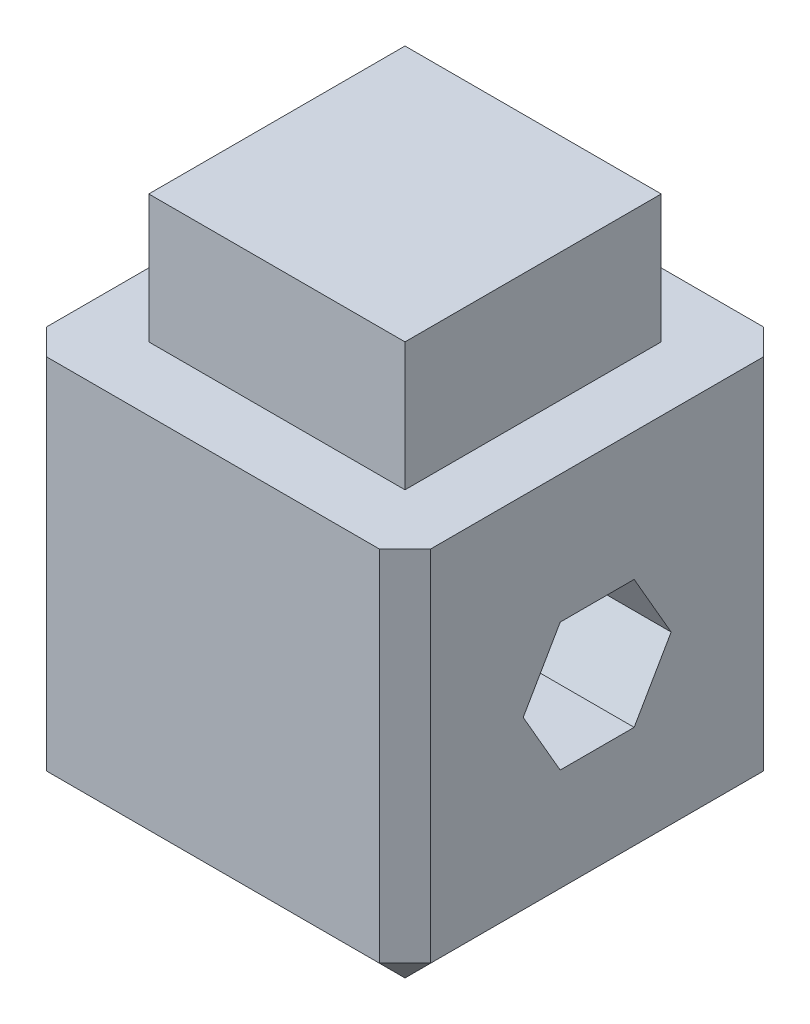
ISO-10303-21;
HEADER;
FILE_DESCRIPTION(('STEP AP214'),'2;1');
FILE_NAME('part.step','',(''),(''),'','','');
FILE_SCHEMA(('AUTOMOTIVE_DESIGN { 1 0 10303 214 1 1 1 1 }'));
ENDSEC;
DATA;
#1=APPLICATION_CONTEXT('core data for automotive mechanical design processes');
#2=APPLICATION_PROTOCOL_DEFINITION('international standard','automotive_design',2000,#1);
#3=PRODUCT_CONTEXT('',#1,'mechanical');
#4=PRODUCT('Part','Part','',(#3));
#5=PRODUCT_RELATED_PRODUCT_CATEGORY('part','',(#4));
#6=PRODUCT_DEFINITION_FORMATION('','',#4);
#7=PRODUCT_DEFINITION_CONTEXT('part definition',#1,'design');
#8=PRODUCT_DEFINITION('design','',#6,#7);
#9=PRODUCT_DEFINITION_SHAPE('','',#8);
#10=(LENGTH_UNIT() NAMED_UNIT(*) SI_UNIT(.MILLI.,.METRE.));
#11=(NAMED_UNIT(*) PLANE_ANGLE_UNIT() SI_UNIT($,.RADIAN.));
#12=(NAMED_UNIT(*) SI_UNIT($,.STERADIAN.) SOLID_ANGLE_UNIT());
#13=UNCERTAINTY_MEASURE_WITH_UNIT(LENGTH_MEASURE(1.E-05),#10,'distance_accuracy_value','');
#14=(GEOMETRIC_REPRESENTATION_CONTEXT(3) GLOBAL_UNCERTAINTY_ASSIGNED_CONTEXT((#13)) GLOBAL_UNIT_ASSIGNED_CONTEXT((#10,
#11,#12)) REPRESENTATION_CONTEXT('',''));
#15=CARTESIAN_POINT('',(0.,0.,0.));
#16=DIRECTION('',(0.,0.,1.));
#17=DIRECTION('',(1.,0.,0.));
#18=AXIS2_PLACEMENT_3D('',#15,#16,#17);
#19=CARTESIAN_POINT('',(19.05,50.8,19.05));
#20=DIRECTION('',(-1.,0.,0.));
#21=DIRECTION('',(0.,0.,1.));
#22=AXIS2_PLACEMENT_3D('',#19,#20,#21);
#23=PLANE('',#22);
#24=DIRECTION('',(0.,-0.866025403784439,-0.5));
#25=VECTOR('',#24,1.);
#26=CARTESIAN_POINT('',(19.05,19.05,7.33234841870825));
#27=LINE('',#26,#25);
#28=CARTESIAN_POINT('',(19.05,19.05,7.33234841870825));
#29=VERTEX_POINT('',#28);
#30=CARTESIAN_POINT('',(19.05,12.7,3.66617420935413));
#31=VERTEX_POINT('',#30);
#32=EDGE_CURVE('E218',#29,#31,#27,.T.);
#33=ORIENTED_EDGE('',*,*,#32,.F.);
#34=DIRECTION('',(0.,-0.866025403784438,0.5));
#35=VECTOR('',#34,1.);
#36=CARTESIAN_POINT('',(19.05,25.4,3.66617420935413));
#37=LINE('',#36,#35);
#38=CARTESIAN_POINT('',(19.05,25.4,3.66617420935413));
#39=VERTEX_POINT('',#38);
#40=EDGE_CURVE('E186',#39,#29,#37,.T.);
#41=ORIENTED_EDGE('',*,*,#40,.F.);
#42=DIRECTION('',(0.,0.,1.));
#43=VECTOR('',#42,1.);
#44=CARTESIAN_POINT('',(19.05,25.4,-3.66617420935412));
#45=LINE('',#44,#43);
#46=CARTESIAN_POINT('',(19.05,25.4,-3.66617420935412));
#47=VERTEX_POINT('',#46);
#48=EDGE_CURVE('E204',#47,#39,#45,.T.);
#49=ORIENTED_EDGE('',*,*,#48,.F.);
#50=DIRECTION('',(0.,0.866025403784439,0.5));
#51=VECTOR('',#50,1.);
#52=CARTESIAN_POINT('',(19.05,19.05,-7.33234841870824));
#53=LINE('',#52,#51);
#54=CARTESIAN_POINT('',(19.05,19.05,-7.33234841870824));
#55=VERTEX_POINT('',#54);
#56=EDGE_CURVE('E207',#55,#47,#53,.T.);
#57=ORIENTED_EDGE('',*,*,#56,.F.);
#58=DIRECTION('',(0.,0.866025403784439,-0.5));
#59=VECTOR('',#58,1.);
#60=CARTESIAN_POINT('',(19.05,12.7,-3.66617420935412));
#61=LINE('',#60,#59);
#62=CARTESIAN_POINT('',(19.05,12.7,-3.66617420935412));
#63=VERTEX_POINT('',#62);
#64=EDGE_CURVE('E223',#63,#55,#61,.T.);
#65=ORIENTED_EDGE('',*,*,#64,.F.);
#66=DIRECTION('',(0.,0.,-1.));
#67=VECTOR('',#66,1.);
#68=CARTESIAN_POINT('',(19.05,12.7,3.66617420935413));
#69=LINE('',#68,#67);
#70=EDGE_CURVE('E220',#31,#63,#69,.T.);
#71=ORIENTED_EDGE('',*,*,#70,.F.);
#72=EDGE_LOOP('',(#33,#41,#49,#57,#65,#71));
#73=FACE_BOUND('',#72,.T.);
#74=DIRECTION('',(0.,0.,-1.));
#75=VECTOR('',#74,1.);
#76=CARTESIAN_POINT('',(19.05,2.54,-19.05));
#77=LINE('',#76,#75);
#78=CARTESIAN_POINT('',(19.05,2.54,16.51));
#79=VERTEX_POINT('',#78);
#80=CARTESIAN_POINT('',(19.05,2.54,-16.51));
#81=VERTEX_POINT('',#80);
#82=EDGE_CURVE('E58',#79,#81,#77,.T.);
#83=ORIENTED_EDGE('',*,*,#82,.T.);
#84=DIRECTION('',(0.,1.,0.));
#85=VECTOR('',#84,1.);
#86=CARTESIAN_POINT('',(19.05,50.8,-16.51));
#87=LINE('',#86,#85);
#88=CARTESIAN_POINT('',(19.05,38.1,-16.51));
#89=VERTEX_POINT('',#88);
#90=EDGE_CURVE('E11',#81,#89,#87,.T.);
#91=ORIENTED_EDGE('',*,*,#90,.T.);
#92=DIRECTION('',(0.,0.,-1.));
#93=VECTOR('',#92,1.);
#94=CARTESIAN_POINT('',(19.05,38.1,19.05));
#95=LINE('',#94,#93);
#96=CARTESIAN_POINT('',(19.05,38.1,16.51));
#97=VERTEX_POINT('',#96);
#98=EDGE_CURVE('E264',#97,#89,#95,.T.);
#99=ORIENTED_EDGE('',*,*,#98,.F.);
#100=DIRECTION('',(0.,-1.,0.));
#101=VECTOR('',#100,1.);
#102=CARTESIAN_POINT('',(19.05,50.8,16.51));
#103=LINE('',#102,#101);
#104=EDGE_CURVE('E51',#97,#79,#103,.T.);
#105=ORIENTED_EDGE('',*,*,#104,.T.);
#106=EDGE_LOOP('',(#83,#91,#99,#105));
#107=FACE_BOUND('',#106,.T.);
#108=ADVANCED_FACE('F41',(#73,#107),#23,.F.);
#109=CARTESIAN_POINT('',(-19.05,50.8,-19.05));
#110=DIRECTION('',(0.,0.,1.));
#111=DIRECTION('',(1.,0.,0.));
#112=AXIS2_PLACEMENT_3D('',#109,#110,#111);
#113=PLANE('',#112);
#114=DIRECTION('',(-1.,0.,0.));
#115=VECTOR('',#114,1.);
#116=CARTESIAN_POINT('',(-19.05,2.54,-19.05));
#117=LINE('',#116,#115);
#118=CARTESIAN_POINT('',(16.51,2.54,-19.05));
#119=VERTEX_POINT('',#118);
#120=CARTESIAN_POINT('',(-16.51,2.54,-19.05));
#121=VERTEX_POINT('',#120);
#122=EDGE_CURVE('E291',#119,#121,#117,.T.);
#123=ORIENTED_EDGE('',*,*,#122,.T.);
#124=DIRECTION('',(0.,1.,0.));
#125=VECTOR('',#124,1.);
#126=CARTESIAN_POINT('',(-16.51,50.8,-19.05));
#127=LINE('',#126,#125);
#128=CARTESIAN_POINT('',(-16.51,38.1,-19.05));
#129=VERTEX_POINT('',#128);
#130=EDGE_CURVE('E293',#121,#129,#127,.T.);
#131=ORIENTED_EDGE('',*,*,#130,.T.);
#132=DIRECTION('',(-1.,0.,0.));
#133=VECTOR('',#132,1.);
#134=CARTESIAN_POINT('',(-19.05,38.1,-19.05));
#135=LINE('',#134,#133);
#136=CARTESIAN_POINT('',(16.51,38.1,-19.05));
#137=VERTEX_POINT('',#136);
#138=EDGE_CURVE('E273',#137,#129,#135,.T.);
#139=ORIENTED_EDGE('',*,*,#138,.F.);
#140=DIRECTION('',(0.,-1.,0.));
#141=VECTOR('',#140,1.);
#142=CARTESIAN_POINT('',(16.51,50.8,-19.05));
#143=LINE('',#142,#141);
#144=EDGE_CURVE('E289',#137,#119,#143,.T.);
#145=ORIENTED_EDGE('',*,*,#144,.T.);
#146=EDGE_LOOP('',(#123,#131,#139,#145));
#147=FACE_BOUND('',#146,.T.);
#148=ADVANCED_FACE('F401',(#147),#113,.F.);
#149=CARTESIAN_POINT('',(-19.05,50.8,19.05));
#150=DIRECTION('',(1.,0.,0.));
#151=DIRECTION('',(0.,0.,-1.));
#152=AXIS2_PLACEMENT_3D('',#149,#150,#151);
#153=PLANE('',#152);
#154=DIRECTION('',(0.,0.,1.));
#155=VECTOR('',#154,1.);
#156=CARTESIAN_POINT('',(-19.05,38.1,19.05));
#157=LINE('',#156,#155);
#158=CARTESIAN_POINT('',(-19.05,38.1,-16.51));
#159=VERTEX_POINT('',#158);
#160=CARTESIAN_POINT('',(-19.05,38.1,16.51));
#161=VERTEX_POINT('',#160);
#162=EDGE_CURVE('E276',#159,#161,#157,.T.);
#163=ORIENTED_EDGE('',*,*,#162,.F.);
#164=DIRECTION('',(0.,-1.,0.));
#165=VECTOR('',#164,1.);
#166=CARTESIAN_POINT('',(-19.05,50.8,-16.51));
#167=LINE('',#166,#165);
#168=CARTESIAN_POINT('',(-19.05,2.54,-16.51));
#169=VERTEX_POINT('',#168);
#170=EDGE_CURVE('E286',#159,#169,#167,.T.);
#171=ORIENTED_EDGE('',*,*,#170,.T.);
#172=DIRECTION('',(0.,0.,1.));
#173=VECTOR('',#172,1.);
#174=CARTESIAN_POINT('',(-19.05,2.54,19.05));
#175=LINE('',#174,#173);
#176=CARTESIAN_POINT('',(-19.05,2.54,16.51));
#177=VERTEX_POINT('',#176);
#178=EDGE_CURVE('E282',#169,#177,#175,.T.);
#179=ORIENTED_EDGE('',*,*,#178,.T.);
#180=DIRECTION('',(0.,1.,0.));
#181=VECTOR('',#180,1.);
#182=CARTESIAN_POINT('',(-19.05,50.8,16.51));
#183=LINE('',#182,#181);
#184=EDGE_CURVE('E284',#177,#161,#183,.T.);
#185=ORIENTED_EDGE('',*,*,#184,.T.);
#186=EDGE_LOOP('',(#163,#171,#179,#185));
#187=FACE_BOUND('',#186,.T.);
#188=DIRECTION('',(0.,0.,1.));
#189=VECTOR('',#188,1.);
#190=CARTESIAN_POINT('',(-19.05,25.4,-3.66617420935412));
#191=LINE('',#190,#189);
#192=CARTESIAN_POINT('',(-19.05,25.4,-3.66617420935412));
#193=VERTEX_POINT('',#192);
#194=CARTESIAN_POINT('',(-19.05,25.4,3.66617420935413));
#195=VERTEX_POINT('',#194);
#196=EDGE_CURVE('E191',#193,#195,#191,.T.);
#197=ORIENTED_EDGE('',*,*,#196,.T.);
#198=DIRECTION('',(0.,-0.866025403784438,0.5));
#199=VECTOR('',#198,1.);
#200=CARTESIAN_POINT('',(-19.05,25.4,3.66617420935413));
#201=LINE('',#200,#199);
#202=CARTESIAN_POINT('',(-19.05,19.05,7.33234841870825));
#203=VERTEX_POINT('',#202);
#204=EDGE_CURVE('E183',#195,#203,#201,.T.);
#205=ORIENTED_EDGE('',*,*,#204,.T.);
#206=DIRECTION('',(0.,-0.866025403784439,-0.5));
#207=VECTOR('',#206,1.);
#208=CARTESIAN_POINT('',(-19.05,19.05,7.33234841870825));
#209=LINE('',#208,#207);
#210=CARTESIAN_POINT('',(-19.05,12.7,3.66617420935413));
#211=VERTEX_POINT('',#210);
#212=EDGE_CURVE('E195',#203,#211,#209,.T.);
#213=ORIENTED_EDGE('',*,*,#212,.T.);
#214=DIRECTION('',(0.,0.,-1.));
#215=VECTOR('',#214,1.);
#216=CARTESIAN_POINT('',(-19.05,12.7,3.66617420935413));
#217=LINE('',#216,#215);
#218=CARTESIAN_POINT('',(-19.05,12.7,-3.66617420935412));
#219=VERTEX_POINT('',#218);
#220=EDGE_CURVE('E199',#211,#219,#217,.T.);
#221=ORIENTED_EDGE('',*,*,#220,.T.);
#222=DIRECTION('',(0.,0.866025403784439,-0.5));
#223=VECTOR('',#222,1.);
#224=CARTESIAN_POINT('',(-19.05,12.7,-3.66617420935412));
#225=LINE('',#224,#223);
#226=CARTESIAN_POINT('',(-19.05,19.05,-7.33234841870824));
#227=VERTEX_POINT('',#226);
#228=EDGE_CURVE('E211',#219,#227,#225,.T.);
#229=ORIENTED_EDGE('',*,*,#228,.T.);
#230=DIRECTION('',(0.,0.866025403784439,0.5));
#231=VECTOR('',#230,1.);
#232=CARTESIAN_POINT('',(-19.05,19.05,-7.33234841870824));
#233=LINE('',#232,#231);
#234=EDGE_CURVE('E214',#227,#193,#233,.T.);
#235=ORIENTED_EDGE('',*,*,#234,.T.);
#236=EDGE_LOOP('',(#197,#205,#213,#221,#229,#235));
#237=FACE_BOUND('',#236,.T.);
#238=ADVANCED_FACE('F201',(#187,#237),#153,.F.);
#239=CARTESIAN_POINT('',(-19.05,50.8,19.05));
#240=DIRECTION('',(0.,0.,-1.));
#241=DIRECTION('',(-1.,0.,0.));
#242=AXIS2_PLACEMENT_3D('',#239,#240,#241);
#243=PLANE('',#242);
#244=DIRECTION('',(1.,0.,0.));
#245=VECTOR('',#244,1.);
#246=CARTESIAN_POINT('',(-19.05,38.1,19.05));
#247=LINE('',#246,#245);
#248=CARTESIAN_POINT('',(-16.51,38.1,19.05));
#249=VERTEX_POINT('',#248);
#250=CARTESIAN_POINT('',(16.51,38.1,19.05));
#251=VERTEX_POINT('',#250);
#252=EDGE_CURVE('E279',#249,#251,#247,.T.);
#253=ORIENTED_EDGE('',*,*,#252,.F.);
#254=DIRECTION('',(0.,-1.,0.));
#255=VECTOR('',#254,1.);
#256=CARTESIAN_POINT('',(-16.51,50.8,19.05));
#257=LINE('',#256,#255);
#258=CARTESIAN_POINT('',(-16.51,2.54,19.05));
#259=VERTEX_POINT('',#258);
#260=EDGE_CURVE('E307',#249,#259,#257,.T.);
#261=ORIENTED_EDGE('',*,*,#260,.T.);
#262=DIRECTION('',(1.,0.,0.));
#263=VECTOR('',#262,1.);
#264=CARTESIAN_POINT('',(19.05,2.54,19.05));
#265=LINE('',#264,#263);
#266=CARTESIAN_POINT('',(16.51,2.54,19.05));
#267=VERTEX_POINT('',#266);
#268=EDGE_CURVE('E303',#259,#267,#265,.T.);
#269=ORIENTED_EDGE('',*,*,#268,.T.);
#270=DIRECTION('',(0.,1.,0.));
#271=VECTOR('',#270,1.);
#272=CARTESIAN_POINT('',(16.51,50.8,19.05));
#273=LINE('',#272,#271);
#274=EDGE_CURVE('E305',#267,#251,#273,.T.);
#275=ORIENTED_EDGE('',*,*,#274,.T.);
#276=EDGE_LOOP('',(#253,#261,#269,#275));
#277=FACE_BOUND('',#276,.T.);
#278=ADVANCED_FACE('F362',(#277),#243,.F.);
#279=CARTESIAN_POINT('',(0.,0.,0.));
#280=DIRECTION('',(0.,-1.,0.));
#281=DIRECTION('',(0.,0.,-1.));
#282=AXIS2_PLACEMENT_3D('',#279,#280,#281);
#283=PLANE('',#282);
#284=DIRECTION('',(-1.,0.,0.));
#285=VECTOR('',#284,1.);
#286=CARTESIAN_POINT('',(-19.05,0.,16.51));
#287=LINE('',#286,#285);
#288=CARTESIAN_POINT('',(16.51,0.,16.51));
#289=VERTEX_POINT('',#288);
#290=CARTESIAN_POINT('',(-16.51,0.,16.51));
#291=VERTEX_POINT('',#290);
#292=EDGE_CURVE('E309',#289,#291,#287,.T.);
#293=ORIENTED_EDGE('',*,*,#292,.T.);
#294=DIRECTION('',(0.,0.,-1.));
#295=VECTOR('',#294,1.);
#296=CARTESIAN_POINT('',(-16.51,0.,-19.05));
#297=LINE('',#296,#295);
#298=CARTESIAN_POINT('',(-16.51,0.,-16.51));
#299=VERTEX_POINT('',#298);
#300=EDGE_CURVE('E315',#291,#299,#297,.T.);
#301=ORIENTED_EDGE('',*,*,#300,.T.);
#302=DIRECTION('',(1.,0.,0.));
#303=VECTOR('',#302,1.);
#304=CARTESIAN_POINT('',(19.05,0.,-16.51));
#305=LINE('',#304,#303);
#306=CARTESIAN_POINT('',(16.51,0.,-16.51));
#307=VERTEX_POINT('',#306);
#308=EDGE_CURVE('E313',#299,#307,#305,.T.);
#309=ORIENTED_EDGE('',*,*,#308,.T.);
#310=DIRECTION('',(0.,0.,1.));
#311=VECTOR('',#310,1.);
#312=CARTESIAN_POINT('',(16.51,0.,19.05));
#313=LINE('',#312,#311);
#314=EDGE_CURVE('E311',#307,#289,#313,.T.);
#315=ORIENTED_EDGE('',*,*,#314,.T.);
#316=EDGE_LOOP('',(#293,#301,#309,#315));
#317=FACE_BOUND('',#316,.T.);
#318=ADVANCED_FACE('F384',(#317),#283,.T.);
#319=CARTESIAN_POINT('',(0.,38.1,0.));
#320=DIRECTION('',(0.,-1.,0.));
#321=DIRECTION('',(0.,0.,-1.));
#322=AXIS2_PLACEMENT_3D('',#319,#320,#321);
#323=PLANE('',#322);
#324=DIRECTION('',(0.,0.,-1.));
#325=VECTOR('',#324,1.);
#326=CARTESIAN_POINT('',(12.7,38.1,12.7));
#327=LINE('',#326,#325);
#328=CARTESIAN_POINT('',(12.7,38.1,12.7));
#329=VERTEX_POINT('',#328);
#330=CARTESIAN_POINT('',(12.7,38.1,-12.7));
#331=VERTEX_POINT('',#330);
#332=EDGE_CURVE('E238',#329,#331,#327,.T.);
#333=ORIENTED_EDGE('',*,*,#332,.F.);
#334=DIRECTION('',(1.,0.,0.));
#335=VECTOR('',#334,1.);
#336=CARTESIAN_POINT('',(-12.7,38.1,12.7));
#337=LINE('',#336,#335);
#338=CARTESIAN_POINT('',(-12.7,38.1,12.7));
#339=VERTEX_POINT('',#338);
#340=EDGE_CURVE('E248',#339,#329,#337,.T.);
#341=ORIENTED_EDGE('',*,*,#340,.F.);
#342=DIRECTION('',(0.,0.,1.));
#343=VECTOR('',#342,1.);
#344=CARTESIAN_POINT('',(-12.7,38.1,12.7));
#345=LINE('',#344,#343);
#346=CARTESIAN_POINT('',(-12.7,38.1,-12.7));
#347=VERTEX_POINT('',#346);
#348=EDGE_CURVE('E245',#347,#339,#345,.T.);
#349=ORIENTED_EDGE('',*,*,#348,.F.);
#350=DIRECTION('',(-1.,0.,0.));
#351=VECTOR('',#350,1.);
#352=CARTESIAN_POINT('',(-12.7,38.1,-12.7));
#353=LINE('',#352,#351);
#354=EDGE_CURVE('E241',#331,#347,#353,.T.);
#355=ORIENTED_EDGE('',*,*,#354,.F.);
#356=EDGE_LOOP('',(#333,#341,#349,#355));
#357=FACE_BOUND('',#356,.T.);
#358=ORIENTED_EDGE('',*,*,#138,.T.);
#359=DIRECTION('',(0.70710678118655,0.,-0.707106781186546));
#360=VECTOR('',#359,1.);
#361=CARTESIAN_POINT('',(-19.05,38.1,-16.51));
#362=LINE('',#361,#360);
#363=EDGE_CURVE('E301',#129,#159,#362,.F.);
#364=ORIENTED_EDGE('',*,*,#363,.T.);
#365=ORIENTED_EDGE('',*,*,#162,.T.);
#366=DIRECTION('',(-0.707106781186546,0.,-0.70710678118655));
#367=VECTOR('',#366,1.);
#368=CARTESIAN_POINT('',(-16.51,38.1,19.05));
#369=LINE('',#368,#367);
#370=EDGE_CURVE('E299',#161,#249,#369,.F.);
#371=ORIENTED_EDGE('',*,*,#370,.T.);
#372=ORIENTED_EDGE('',*,*,#252,.T.);
#373=DIRECTION('',(-0.707106781186546,0.,0.70710678118655));
#374=VECTOR('',#373,1.);
#375=CARTESIAN_POINT('',(19.05,38.1,16.51));
#376=LINE('',#375,#374);
#377=EDGE_CURVE('E295',#251,#97,#376,.F.);
#378=ORIENTED_EDGE('',*,*,#377,.T.);
#379=ORIENTED_EDGE('',*,*,#98,.T.);
#380=DIRECTION('',(0.707106781186546,0.,0.70710678118655));
#381=VECTOR('',#380,1.);
#382=CARTESIAN_POINT('',(16.51,38.1,-19.05));
#383=LINE('',#382,#381);
#384=EDGE_CURVE('E297',#89,#137,#383,.F.);
#385=ORIENTED_EDGE('',*,*,#384,.T.);
#386=EDGE_LOOP('',(#358,#364,#365,#371,#372,#378,#379,#385));
#387=FACE_BOUND('',#386,.T.);
#388=ADVANCED_FACE('F365',(#357,#387),#323,.F.);
#389=CARTESIAN_POINT('',(12.7,38.1,12.7));
#390=DIRECTION('',(1.,0.,0.));
#391=DIRECTION('',(0.,0.,-1.));
#392=AXIS2_PLACEMENT_3D('',#389,#390,#391);
#393=PLANE('',#392);
#394=DIRECTION('',(0.,0.,-1.));
#395=VECTOR('',#394,1.);
#396=CARTESIAN_POINT('',(12.7,50.8,12.7));
#397=LINE('',#396,#395);
#398=CARTESIAN_POINT('',(12.7,50.8,12.7));
#399=VERTEX_POINT('',#398);
#400=CARTESIAN_POINT('',(12.7,50.8,-12.7));
#401=VERTEX_POINT('',#400);
#402=EDGE_CURVE('E230',#399,#401,#397,.T.);
#403=ORIENTED_EDGE('',*,*,#402,.F.);
#404=DIRECTION('',(0.,1.,0.));
#405=VECTOR('',#404,1.);
#406=CARTESIAN_POINT('',(12.7,38.1,12.7));
#407=LINE('',#406,#405);
#408=EDGE_CURVE('E262',#329,#399,#407,.T.);
#409=ORIENTED_EDGE('',*,*,#408,.F.);
#410=ORIENTED_EDGE('',*,*,#332,.T.);
#411=DIRECTION('',(0.,1.,0.));
#412=VECTOR('',#411,1.);
#413=CARTESIAN_POINT('',(12.7,38.1,-12.7));
#414=LINE('',#413,#412);
#415=EDGE_CURVE('E251',#331,#401,#414,.T.);
#416=ORIENTED_EDGE('',*,*,#415,.T.);
#417=EDGE_LOOP('',(#403,#409,#410,#416));
#418=FACE_BOUND('',#417,.T.);
#419=ADVANCED_FACE('F504',(#418),#393,.T.);
#420=CARTESIAN_POINT('',(-12.7,38.1,12.7));
#421=DIRECTION('',(0.,0.,1.));
#422=DIRECTION('',(1.,0.,0.));
#423=AXIS2_PLACEMENT_3D('',#420,#421,#422);
#424=PLANE('',#423);
#425=DIRECTION('',(1.,0.,0.));
#426=VECTOR('',#425,1.);
#427=CARTESIAN_POINT('',(-12.7,50.8,12.7));
#428=LINE('',#427,#426);
#429=CARTESIAN_POINT('',(-12.7,50.8,12.7));
#430=VERTEX_POINT('',#429);
#431=EDGE_CURVE('E242',#430,#399,#428,.T.);
#432=ORIENTED_EDGE('',*,*,#431,.F.);
#433=DIRECTION('',(0.,1.,0.));
#434=VECTOR('',#433,1.);
#435=CARTESIAN_POINT('',(-12.7,38.1,12.7));
#436=LINE('',#435,#434);
#437=EDGE_CURVE('E265',#339,#430,#436,.T.);
#438=ORIENTED_EDGE('',*,*,#437,.F.);
#439=ORIENTED_EDGE('',*,*,#340,.T.);
#440=ORIENTED_EDGE('',*,*,#408,.T.);
#441=EDGE_LOOP('',(#432,#438,#439,#440));
#442=FACE_BOUND('',#441,.T.);
#443=ADVANCED_FACE('F500',(#442),#424,.T.);
#444=CARTESIAN_POINT('',(-12.7,38.1,12.7));
#445=DIRECTION('',(-1.,0.,0.));
#446=DIRECTION('',(0.,0.,1.));
#447=AXIS2_PLACEMENT_3D('',#444,#445,#446);
#448=PLANE('',#447);
#449=DIRECTION('',(0.,0.,1.));
#450=VECTOR('',#449,1.);
#451=CARTESIAN_POINT('',(-12.7,50.8,12.7));
#452=LINE('',#451,#450);
#453=CARTESIAN_POINT('',(-12.7,50.8,-12.7));
#454=VERTEX_POINT('',#453);
#455=EDGE_CURVE('E257',#454,#430,#452,.T.);
#456=ORIENTED_EDGE('',*,*,#455,.F.);
#457=DIRECTION('',(0.,1.,0.));
#458=VECTOR('',#457,1.);
#459=CARTESIAN_POINT('',(-12.7,38.1,-12.7));
#460=LINE('',#459,#458);
#461=EDGE_CURVE('E267',#347,#454,#460,.T.);
#462=ORIENTED_EDGE('',*,*,#461,.F.);
#463=ORIENTED_EDGE('',*,*,#348,.T.);
#464=ORIENTED_EDGE('',*,*,#437,.T.);
#465=EDGE_LOOP('',(#456,#462,#463,#464));
#466=FACE_BOUND('',#465,.T.);
#467=ADVANCED_FACE('F503',(#466),#448,.T.);
#468=CARTESIAN_POINT('',(-12.7,38.1,-12.7));
#469=DIRECTION('',(0.,0.,-1.));
#470=DIRECTION('',(-1.,0.,0.));
#471=AXIS2_PLACEMENT_3D('',#468,#469,#470);
#472=PLANE('',#471);
#473=DIRECTION('',(-1.,0.,0.));
#474=VECTOR('',#473,1.);
#475=CARTESIAN_POINT('',(-12.7,50.8,-12.7));
#476=LINE('',#475,#474);
#477=EDGE_CURVE('E254',#401,#454,#476,.T.);
#478=ORIENTED_EDGE('',*,*,#477,.F.);
#479=ORIENTED_EDGE('',*,*,#415,.F.);
#480=ORIENTED_EDGE('',*,*,#354,.T.);
#481=ORIENTED_EDGE('',*,*,#461,.T.);
#482=EDGE_LOOP('',(#478,#479,#480,#481));
#483=FACE_BOUND('',#482,.T.);
#484=ADVANCED_FACE('F508',(#483),#472,.T.);
#485=CARTESIAN_POINT('',(0.,50.8,0.));
#486=DIRECTION('',(0.,-1.,0.));
#487=DIRECTION('',(0.,0.,-1.));
#488=AXIS2_PLACEMENT_3D('',#485,#486,#487);
#489=PLANE('',#488);
#490=ORIENTED_EDGE('',*,*,#402,.T.);
#491=ORIENTED_EDGE('',*,*,#477,.T.);
#492=ORIENTED_EDGE('',*,*,#455,.T.);
#493=ORIENTED_EDGE('',*,*,#431,.T.);
#494=EDGE_LOOP('',(#490,#491,#492,#493));
#495=FACE_BOUND('',#494,.T.);
#496=ADVANCED_FACE('F499',(#495),#489,.F.);
#497=CARTESIAN_POINT('',(-19.05,25.4,3.66617420935413));
#498=DIRECTION('',(0.,0.5,0.866025403784439));
#499=DIRECTION('',(0.,-0.866025403784439,0.5));
#500=AXIS2_PLACEMENT_3D('',#497,#498,#499);
#501=PLANE('',#500);
#502=ORIENTED_EDGE('',*,*,#40,.T.);
#503=DIRECTION('',(1.,0.,0.));
#504=VECTOR('',#503,1.);
#505=CARTESIAN_POINT('',(-19.05,19.05,7.33234841870825));
#506=LINE('',#505,#504);
#507=EDGE_CURVE('E179',#203,#29,#506,.T.);
#508=ORIENTED_EDGE('',*,*,#507,.F.);
#509=ORIENTED_EDGE('',*,*,#204,.F.);
#510=DIRECTION('',(1.,0.,0.));
#511=VECTOR('',#510,1.);
#512=CARTESIAN_POINT('',(-19.05,25.4,3.66617420935413));
#513=LINE('',#512,#511);
#514=EDGE_CURVE('E228',#195,#39,#513,.T.);
#515=ORIENTED_EDGE('',*,*,#514,.T.);
#516=EDGE_LOOP('',(#502,#508,#509,#515));
#517=FACE_BOUND('',#516,.T.);
#518=ADVANCED_FACE('F181',(#517),#501,.F.);
#519=CARTESIAN_POINT('',(-19.05,25.4,-3.66617420935412));
#520=DIRECTION('',(0.,1.,0.));
#521=DIRECTION('',(0.,0.,1.));
#522=AXIS2_PLACEMENT_3D('',#519,#520,#521);
#523=PLANE('',#522);
#524=ORIENTED_EDGE('',*,*,#48,.T.);
#525=ORIENTED_EDGE('',*,*,#514,.F.);
#526=ORIENTED_EDGE('',*,*,#196,.F.);
#527=DIRECTION('',(1.,0.,0.));
#528=VECTOR('',#527,1.);
#529=CARTESIAN_POINT('',(-19.05,25.4,-3.66617420935412));
#530=LINE('',#529,#528);
#531=EDGE_CURVE('E231',#193,#47,#530,.T.);
#532=ORIENTED_EDGE('',*,*,#531,.T.);
#533=EDGE_LOOP('',(#524,#525,#526,#532));
#534=FACE_BOUND('',#533,.T.);
#535=ADVANCED_FACE('F498',(#534),#523,.F.);
#536=CARTESIAN_POINT('',(-19.05,19.05,-7.33234841870824));
#537=DIRECTION('',(0.,0.5,-0.866025403784439));
#538=DIRECTION('',(0.,0.866025403784439,0.5));
#539=AXIS2_PLACEMENT_3D('',#536,#537,#538);
#540=PLANE('',#539);
#541=ORIENTED_EDGE('',*,*,#56,.T.);
#542=ORIENTED_EDGE('',*,*,#531,.F.);
#543=ORIENTED_EDGE('',*,*,#234,.F.);
#544=DIRECTION('',(1.,0.,0.));
#545=VECTOR('',#544,1.);
#546=CARTESIAN_POINT('',(-19.05,19.05,-7.33234841870824));
#547=LINE('',#546,#545);
#548=EDGE_CURVE('E233',#227,#55,#547,.T.);
#549=ORIENTED_EDGE('',*,*,#548,.T.);
#550=EDGE_LOOP('',(#541,#542,#543,#549));
#551=FACE_BOUND('',#550,.T.);
#552=ADVANCED_FACE('F561',(#551),#540,.F.);
#553=CARTESIAN_POINT('',(-19.05,12.7,-3.66617420935412));
#554=DIRECTION('',(0.,-0.5,-0.866025403784439));
#555=DIRECTION('',(0.,0.866025403784439,-0.5));
#556=AXIS2_PLACEMENT_3D('',#553,#554,#555);
#557=PLANE('',#556);
#558=ORIENTED_EDGE('',*,*,#64,.T.);
#559=ORIENTED_EDGE('',*,*,#548,.F.);
#560=ORIENTED_EDGE('',*,*,#228,.F.);
#561=DIRECTION('',(1.,0.,0.));
#562=VECTOR('',#561,1.);
#563=CARTESIAN_POINT('',(-19.05,12.7,-3.66617420935412));
#564=LINE('',#563,#562);
#565=EDGE_CURVE('E235',#219,#63,#564,.T.);
#566=ORIENTED_EDGE('',*,*,#565,.T.);
#567=EDGE_LOOP('',(#558,#559,#560,#566));
#568=FACE_BOUND('',#567,.T.);
#569=ADVANCED_FACE('F491',(#568),#557,.F.);
#570=CARTESIAN_POINT('',(-19.05,12.7,3.66617420935413));
#571=DIRECTION('',(0.,-1.,0.));
#572=DIRECTION('',(0.,0.,-1.));
#573=AXIS2_PLACEMENT_3D('',#570,#571,#572);
#574=PLANE('',#573);
#575=ORIENTED_EDGE('',*,*,#70,.T.);
#576=ORIENTED_EDGE('',*,*,#565,.F.);
#577=ORIENTED_EDGE('',*,*,#220,.F.);
#578=DIRECTION('',(1.,0.,0.));
#579=VECTOR('',#578,1.);
#580=CARTESIAN_POINT('',(-19.05,12.7,3.66617420935413));
#581=LINE('',#580,#579);
#582=EDGE_CURVE('E190',#211,#31,#581,.T.);
#583=ORIENTED_EDGE('',*,*,#582,.T.);
#584=EDGE_LOOP('',(#575,#576,#577,#583));
#585=FACE_BOUND('',#584,.T.);
#586=ADVANCED_FACE('F486',(#585),#574,.F.);
#587=CARTESIAN_POINT('',(-19.05,19.05,7.33234841870825));
#588=DIRECTION('',(0.,-0.5,0.866025403784439));
#589=DIRECTION('',(0.,-0.866025403784439,-0.5));
#590=AXIS2_PLACEMENT_3D('',#587,#588,#589);
#591=PLANE('',#590);
#592=ORIENTED_EDGE('',*,*,#32,.T.);
#593=ORIENTED_EDGE('',*,*,#582,.F.);
#594=ORIENTED_EDGE('',*,*,#212,.F.);
#595=ORIENTED_EDGE('',*,*,#507,.T.);
#596=EDGE_LOOP('',(#592,#593,#594,#595));
#597=FACE_BOUND('',#596,.T.);
#598=ADVANCED_FACE('F196',(#597),#591,.F.);
#599=CARTESIAN_POINT('',(19.05,50.8,16.51));
#600=DIRECTION('',(-0.70710678118655,0.,-0.707106781186546));
#601=DIRECTION('',(0.,-1.,0.));
#602=AXIS2_PLACEMENT_3D('',#599,#600,#601);
#603=PLANE('',#602);
#604=DIRECTION('',(0.707106781186546,0.,-0.707106781186549));
#605=VECTOR('',#604,1.);
#606=CARTESIAN_POINT('',(19.05,2.54,16.51));
#607=LINE('',#606,#605);
#608=EDGE_CURVE('E46',#79,#267,#607,.F.);
#609=ORIENTED_EDGE('',*,*,#608,.F.);
#610=ORIENTED_EDGE('',*,*,#104,.F.);
#611=ORIENTED_EDGE('',*,*,#377,.F.);
#612=ORIENTED_EDGE('',*,*,#274,.F.);
#613=EDGE_LOOP('',(#609,#610,#611,#612));
#614=FACE_BOUND('',#613,.T.);
#615=ADVANCED_FACE('F44',(#614),#603,.F.);
#616=CARTESIAN_POINT('',(19.05,2.54,16.51));
#617=DIRECTION('',(0.577350269189626,-0.577350269189629,0.577350269189623));
#618=DIRECTION('',(0.707106781186549,0.707106781186546,0.));
#619=AXIS2_PLACEMENT_3D('',#616,#617,#618);
#620=PLANE('',#619);
#621=DIRECTION('',(0.707106781186549,0.707106781186545,0.));
#622=VECTOR('',#621,1.);
#623=CARTESIAN_POINT('',(19.05,2.54,16.51));
#624=LINE('',#623,#622);
#625=EDGE_CURVE('E345',#79,#289,#624,.F.);
#626=ORIENTED_EDGE('',*,*,#625,.F.);
#627=ORIENTED_EDGE('',*,*,#608,.T.);
#628=DIRECTION('',(0.,-0.707106781186546,-0.70710678118655));
#629=VECTOR('',#628,1.);
#630=CARTESIAN_POINT('',(16.51,1.27,17.78));
#631=LINE('',#630,#629);
#632=EDGE_CURVE('E347',#289,#267,#631,.F.);
#633=ORIENTED_EDGE('',*,*,#632,.F.);
#634=EDGE_LOOP('',(#626,#627,#633));
#635=FACE_BOUND('',#634,.T.);
#636=ADVANCED_FACE('F356',(#635),#620,.T.);
#637=CARTESIAN_POINT('',(-16.51,50.8,19.05));
#638=DIRECTION('',(0.70710678118655,0.,-0.707106781186546));
#639=DIRECTION('',(0.,-1.,0.));
#640=AXIS2_PLACEMENT_3D('',#637,#638,#639);
#641=PLANE('',#640);
#642=ORIENTED_EDGE('',*,*,#370,.F.);
#643=ORIENTED_EDGE('',*,*,#184,.F.);
#644=DIRECTION('',(0.707106781186546,0.,0.707106781186549));
#645=VECTOR('',#644,1.);
#646=CARTESIAN_POINT('',(-16.51,2.54,19.05));
#647=LINE('',#646,#645);
#648=EDGE_CURVE('E342',#259,#177,#647,.F.);
#649=ORIENTED_EDGE('',*,*,#648,.F.);
#650=ORIENTED_EDGE('',*,*,#260,.F.);
#651=EDGE_LOOP('',(#642,#643,#649,#650));
#652=FACE_BOUND('',#651,.T.);
#653=ADVANCED_FACE('F370',(#652),#641,.F.);
#654=CARTESIAN_POINT('',(-19.05,2.54,19.05));
#655=DIRECTION('',(0.,-0.70710678118655,0.707106781186546));
#656=DIRECTION('',(-1.,0.,0.));
#657=AXIS2_PLACEMENT_3D('',#654,#655,#656);
#658=PLANE('',#657);
#659=ORIENTED_EDGE('',*,*,#632,.T.);
#660=ORIENTED_EDGE('',*,*,#268,.F.);
#661=DIRECTION('',(0.,0.707106781186546,0.70710678118655));
#662=VECTOR('',#661,1.);
#663=CARTESIAN_POINT('',(-16.51,2.54,19.05));
#664=LINE('',#663,#662);
#665=EDGE_CURVE('E339',#291,#259,#664,.T.);
#666=ORIENTED_EDGE('',*,*,#665,.F.);
#667=ORIENTED_EDGE('',*,*,#292,.F.);
#668=EDGE_LOOP('',(#659,#660,#666,#667));
#669=FACE_BOUND('',#668,.T.);
#670=ADVANCED_FACE('F373',(#669),#658,.T.);
#671=CARTESIAN_POINT('',(19.05,2.54,19.05));
#672=DIRECTION('',(0.707106781186546,-0.70710678118655,0.));
#673=DIRECTION('',(0.,0.,1.));
#674=AXIS2_PLACEMENT_3D('',#671,#672,#673);
#675=PLANE('',#674);
#676=ORIENTED_EDGE('',*,*,#625,.T.);
#677=ORIENTED_EDGE('',*,*,#314,.F.);
#678=DIRECTION('',(-0.707106781186549,-0.707106781186545,0.));
#679=VECTOR('',#678,1.);
#680=CARTESIAN_POINT('',(16.51,0.,-16.51));
#681=LINE('',#680,#679);
#682=EDGE_CURVE('E336',#81,#307,#681,.T.);
#683=ORIENTED_EDGE('',*,*,#682,.F.);
#684=ORIENTED_EDGE('',*,*,#82,.F.);
#685=EDGE_LOOP('',(#676,#677,#683,#684));
#686=FACE_BOUND('',#685,.T.);
#687=ADVANCED_FACE('F388',(#686),#675,.T.);
#688=CARTESIAN_POINT('',(16.51,50.8,-19.05));
#689=DIRECTION('',(-0.70710678118655,0.,0.707106781186546));
#690=DIRECTION('',(0.,-1.,0.));
#691=AXIS2_PLACEMENT_3D('',#688,#689,#690);
#692=PLANE('',#691);
#693=ORIENTED_EDGE('',*,*,#384,.F.);
#694=ORIENTED_EDGE('',*,*,#90,.F.);
#695=DIRECTION('',(-0.707106781186546,0.,-0.707106781186549));
#696=VECTOR('',#695,1.);
#697=CARTESIAN_POINT('',(17.78,2.54,-17.78));
#698=LINE('',#697,#696);
#699=EDGE_CURVE('E333',#119,#81,#698,.F.);
#700=ORIENTED_EDGE('',*,*,#699,.F.);
#701=ORIENTED_EDGE('',*,*,#144,.F.);
#702=EDGE_LOOP('',(#693,#694,#700,#701));
#703=FACE_BOUND('',#702,.T.);
#704=ADVANCED_FACE('F397',(#703),#692,.F.);
#705=CARTESIAN_POINT('',(-16.51,2.54,19.05));
#706=DIRECTION('',(-0.577350269189626,-0.577350269189629,0.577350269189623));
#707=DIRECTION('',(0.707106781186549,-0.707106781186546,0.));
#708=AXIS2_PLACEMENT_3D('',#705,#706,#707);
#709=PLANE('',#708);
#710=ORIENTED_EDGE('',*,*,#665,.T.);
#711=ORIENTED_EDGE('',*,*,#648,.T.);
#712=DIRECTION('',(0.707106781186549,-0.707106781186545,0.));
#713=VECTOR('',#712,1.);
#714=CARTESIAN_POINT('',(-17.78,1.27,16.51));
#715=LINE('',#714,#713);
#716=EDGE_CURVE('E330',#291,#177,#715,.F.);
#717=ORIENTED_EDGE('',*,*,#716,.F.);
#718=EDGE_LOOP('',(#710,#711,#717));
#719=FACE_BOUND('',#718,.T.);
#720=ADVANCED_FACE('F377',(#719),#709,.T.);
#721=CARTESIAN_POINT('',(16.51,0.,-16.51));
#722=DIRECTION('',(0.577350269189626,-0.577350269189629,-0.577350269189623));
#723=DIRECTION('',(0.707106781186549,0.707106781186546,0.));
#724=AXIS2_PLACEMENT_3D('',#721,#722,#723);
#725=PLANE('',#724);
#726=ORIENTED_EDGE('',*,*,#699,.T.);
#727=ORIENTED_EDGE('',*,*,#682,.T.);
#728=DIRECTION('',(0.,0.707106781186546,-0.70710678118655));
#729=VECTOR('',#728,1.);
#730=CARTESIAN_POINT('',(16.51,0.,-16.51));
#731=LINE('',#730,#729);
#732=EDGE_CURVE('E327',#119,#307,#731,.F.);
#733=ORIENTED_EDGE('',*,*,#732,.F.);
#734=EDGE_LOOP('',(#726,#727,#733));
#735=FACE_BOUND('',#734,.T.);
#736=ADVANCED_FACE('F392',(#735),#725,.T.);
#737=CARTESIAN_POINT('',(-19.05,2.54,19.05));
#738=DIRECTION('',(-0.707106781186546,-0.70710678118655,0.));
#739=DIRECTION('',(0.,0.,-1.));
#740=AXIS2_PLACEMENT_3D('',#737,#738,#739);
#741=PLANE('',#740);
#742=ORIENTED_EDGE('',*,*,#716,.T.);
#743=ORIENTED_EDGE('',*,*,#178,.F.);
#744=DIRECTION('',(-0.70710678118655,0.707106781186546,0.));
#745=VECTOR('',#744,1.);
#746=CARTESIAN_POINT('',(-19.05,2.54,-16.51));
#747=LINE('',#746,#745);
#748=EDGE_CURVE('E324',#299,#169,#747,.T.);
#749=ORIENTED_EDGE('',*,*,#748,.F.);
#750=ORIENTED_EDGE('',*,*,#300,.F.);
#751=EDGE_LOOP('',(#742,#743,#749,#750));
#752=FACE_BOUND('',#751,.T.);
#753=ADVANCED_FACE('F381',(#752),#741,.T.);
#754=CARTESIAN_POINT('',(-19.05,2.54,-19.05));
#755=DIRECTION('',(0.,-0.70710678118655,-0.707106781186546));
#756=DIRECTION('',(1.,0.,0.));
#757=AXIS2_PLACEMENT_3D('',#754,#755,#756);
#758=PLANE('',#757);
#759=ORIENTED_EDGE('',*,*,#732,.T.);
#760=ORIENTED_EDGE('',*,*,#308,.F.);
#761=DIRECTION('',(0.,-0.707106781186545,0.707106781186549));
#762=VECTOR('',#761,1.);
#763=CARTESIAN_POINT('',(-16.51,1.27,-17.78));
#764=LINE('',#763,#762);
#765=EDGE_CURVE('E322',#121,#299,#764,.T.);
#766=ORIENTED_EDGE('',*,*,#765,.F.);
#767=ORIENTED_EDGE('',*,*,#122,.F.);
#768=EDGE_LOOP('',(#759,#760,#766,#767));
#769=FACE_BOUND('',#768,.T.);
#770=ADVANCED_FACE('F436',(#769),#758,.T.);
#771=CARTESIAN_POINT('',(-19.05,2.54,-16.51));
#772=DIRECTION('',(-0.577350269189623,-0.577350269189629,-0.577350269189626));
#773=DIRECTION('',(0.,0.707106781186546,-0.707106781186549));
#774=AXIS2_PLACEMENT_3D('',#771,#772,#773);
#775=PLANE('',#774);
#776=ORIENTED_EDGE('',*,*,#765,.T.);
#777=ORIENTED_EDGE('',*,*,#748,.T.);
#778=DIRECTION('',(-0.707106781186549,0.,0.707106781186546));
#779=VECTOR('',#778,1.);
#780=CARTESIAN_POINT('',(-19.05,2.54,-16.51));
#781=LINE('',#780,#779);
#782=EDGE_CURVE('E320',#121,#169,#781,.T.);
#783=ORIENTED_EDGE('',*,*,#782,.F.);
#784=EDGE_LOOP('',(#776,#777,#783));
#785=FACE_BOUND('',#784,.T.);
#786=ADVANCED_FACE('F409',(#785),#775,.T.);
#787=CARTESIAN_POINT('',(-19.05,50.8,-16.51));
#788=DIRECTION('',(0.707106781186546,0.,0.70710678118655));
#789=DIRECTION('',(0.,-1.,0.));
#790=AXIS2_PLACEMENT_3D('',#787,#788,#789);
#791=PLANE('',#790);
#792=ORIENTED_EDGE('',*,*,#363,.F.);
#793=ORIENTED_EDGE('',*,*,#130,.F.);
#794=ORIENTED_EDGE('',*,*,#782,.T.);
#795=ORIENTED_EDGE('',*,*,#170,.F.);
#796=EDGE_LOOP('',(#792,#793,#794,#795));
#797=FACE_BOUND('',#796,.T.);
#798=ADVANCED_FACE('F406',(#797),#791,.F.);
#799=CLOSED_SHELL('',(#108,#148,#238,#278,#318,#388,#419,#443,#467,#484,#496,#518,#535,#552,
#569,#586,#598,#615,#636,#653,#670,#687,#704,#720,#736,#753,#770,#786,#798));
#800=MANIFOLD_SOLID_BREP('B2',#799);
#801=ADVANCED_BREP_SHAPE_REPRESENTATION('',(#18,#800),#14);
#802=SHAPE_DEFINITION_REPRESENTATION(#9,#801);
ENDSEC;
END-ISO-10303-21;
